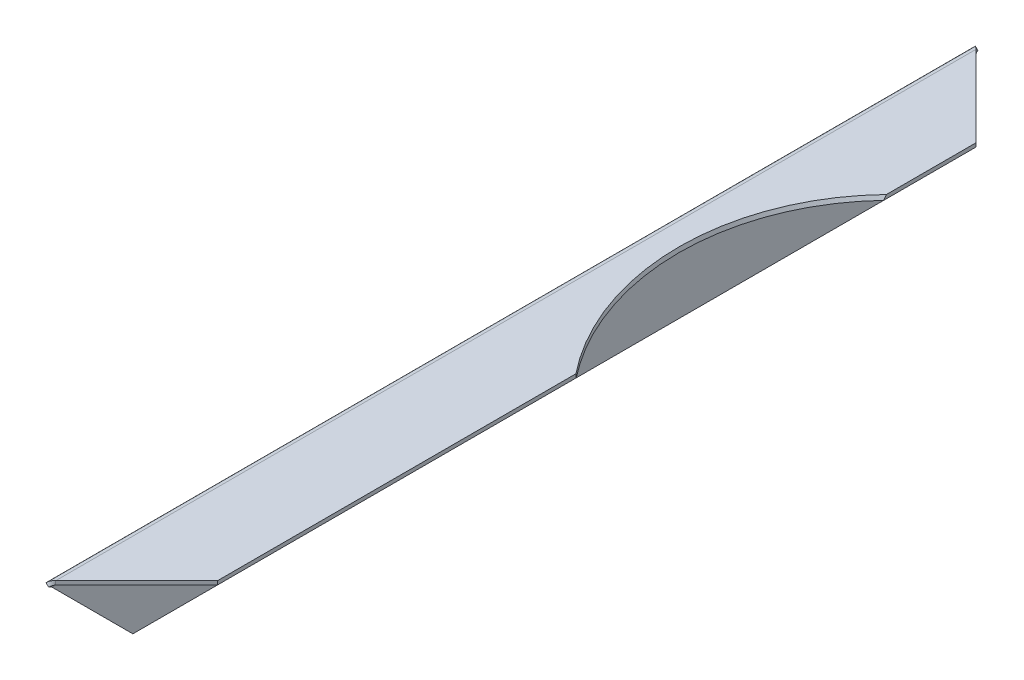
ISO-10303-21;
HEADER;
FILE_DESCRIPTION(('STEP AP214'),'2;1');
FILE_NAME('part.step','',(''),(''),'','','');
FILE_SCHEMA(('AUTOMOTIVE_DESIGN { 1 0 10303 214 1 1 1 1 }'));
ENDSEC;
DATA;
#1=APPLICATION_CONTEXT('core data for automotive mechanical design processes');
#2=APPLICATION_PROTOCOL_DEFINITION('international standard','automotive_design',2000,#1);
#3=PRODUCT_CONTEXT('',#1,'mechanical');
#4=PRODUCT('Part','Part','',(#3));
#5=PRODUCT_RELATED_PRODUCT_CATEGORY('part','',(#4));
#6=PRODUCT_DEFINITION_FORMATION('','',#4);
#7=PRODUCT_DEFINITION_CONTEXT('part definition',#1,'design');
#8=PRODUCT_DEFINITION('design','',#6,#7);
#9=PRODUCT_DEFINITION_SHAPE('','',#8);
#10=(LENGTH_UNIT() NAMED_UNIT(*) SI_UNIT(.MILLI.,.METRE.));
#11=(NAMED_UNIT(*) PLANE_ANGLE_UNIT() SI_UNIT($,.RADIAN.));
#12=(NAMED_UNIT(*) SI_UNIT($,.STERADIAN.) SOLID_ANGLE_UNIT());
#13=UNCERTAINTY_MEASURE_WITH_UNIT(LENGTH_MEASURE(1.E-05),#10,'distance_accuracy_value','');
#14=(GEOMETRIC_REPRESENTATION_CONTEXT(3) GLOBAL_UNCERTAINTY_ASSIGNED_CONTEXT((#13)) GLOBAL_UNIT_ASSIGNED_CONTEXT((#10,
#11,#12)) REPRESENTATION_CONTEXT('',''));
#15=CARTESIAN_POINT('',(0.,0.,0.));
#16=DIRECTION('',(0.,0.,1.));
#17=DIRECTION('',(1.,0.,0.));
#18=AXIS2_PLACEMENT_3D('',#15,#16,#17);
#19=CARTESIAN_POINT('',(-75.1616434307379,91.8897069999997,74.9733070000015));
#20=DIRECTION('',(-1.,0.,0.));
#21=DIRECTION('',(0.,0.,-1.));
#22=AXIS2_PLACEMENT_3D('',#19,#20,#21);
#23=PLANE('',#22);
#24=DIRECTION('',(0.,0.,1.));
#25=VECTOR('',#24,1.);
#26=CARTESIAN_POINT('',(-75.1616434307379,92.6263069999997,74.9733070000015));
#27=LINE('',#26,#25);
#28=CARTESIAN_POINT('',(-75.1616434307379,92.6263069999997,-74.9733070000015));
#29=VERTEX_POINT('',#28);
#30=CARTESIAN_POINT('',(-75.1616434307379,92.6263069999997,-57.2131080184539));
#31=VERTEX_POINT('',#30);
#32=EDGE_CURVE('E140',#29,#31,#27,.T.);
#33=ORIENTED_EDGE('',*,*,#32,.T.);
#34=CARTESIAN_POINT('',(-75.1616434307382,194.963224817041,-58.1000141663));
#35=DIRECTION('',(-1.,0.,0.));
#36=DIRECTION('',(0.,0.945156330465368,-0.326618295539672));
#37=AXIS2_PLACEMENT_3D('',#34,#35,#36);
#38=ELLIPSE('',#37,142.645185752417,44.45);
#39=CARTESIAN_POINT('',(-75.1616434307379,91.8897069999997,-56.6912719363768));
#40=VERTEX_POINT('',#39);
#41=EDGE_CURVE('E47',#31,#40,#38,.T.);
#42=ORIENTED_EDGE('',*,*,#41,.T.);
#43=DIRECTION('',(0.,0.,1.));
#44=VECTOR('',#43,1.);
#45=CARTESIAN_POINT('',(-75.1616434307379,91.8897069999997,74.9733070000015));
#46=LINE('',#45,#44);
#47=CARTESIAN_POINT('',(-75.1616434307379,91.8897069999997,-74.9733070000015));
#48=VERTEX_POINT('',#47);
#49=EDGE_CURVE('E372',#48,#40,#46,.T.);
#50=ORIENTED_EDGE('',*,*,#49,.F.);
#51=DIRECTION('',(0.,1.,0.));
#52=VECTOR('',#51,1.);
#53=CARTESIAN_POINT('',(-75.1616434307379,91.8897069999997,-74.9733070000015));
#54=LINE('',#53,#52);
#55=EDGE_CURVE('E143',#48,#29,#54,.T.);
#56=ORIENTED_EDGE('',*,*,#55,.T.);
#57=EDGE_LOOP('',(#33,#42,#50,#56));
#58=FACE_BOUND('',#57,.T.);
#59=ADVANCED_FACE('F32',(#58),#23,.F.);
#60=CARTESIAN_POINT('',(-92.6263069999994,0.18833643072165,0.));
#61=DIRECTION('',(-1.,0.,0.));
#62=DIRECTION('',(0.,0.,1.));
#63=AXIS2_PLACEMENT_3D('',#60,#61,#62);
#64=PLANE('',#63);
#65=DIRECTION('',(0.,-0.707106781186615,-0.70710678118648));
#66=VECTOR('',#65,1.);
#67=CARTESIAN_POINT('',(-92.6263070000001,92.0208934307375,91.8325569999984));
#68=LINE('',#67,#66);
#69=CARTESIAN_POINT('',(-92.6263070000001,91.1531069999997,90.9647705692607));
#70=VERTEX_POINT('',#69);
#71=CARTESIAN_POINT('',(-92.626307,75.1616434307375,74.9733070000015));
#72=VERTEX_POINT('',#71);
#73=EDGE_CURVE('E55',#70,#72,#68,.T.);
#74=ORIENTED_EDGE('',*,*,#73,.F.);
#75=DIRECTION('',(0.,0.,-1.));
#76=VECTOR('',#75,1.);
#77=CARTESIAN_POINT('',(-92.6263070000001,91.1531069999997,0.));
#78=LINE('',#77,#76);
#79=CARTESIAN_POINT('',(-92.626307,91.1531069999997,-90.9647705692606));
#80=VERTEX_POINT('',#79);
#81=EDGE_CURVE('E239',#70,#80,#78,.T.);
#82=ORIENTED_EDGE('',*,*,#81,.T.);
#83=DIRECTION('',(0.,0.707106781186615,-0.70710678118648));
#84=VECTOR('',#83,1.);
#85=CARTESIAN_POINT('',(-92.6263070000001,92.0208934307375,-91.8325569999983));
#86=LINE('',#85,#84);
#87=CARTESIAN_POINT('',(-92.626307,75.1616434307375,-74.9733070000015));
#88=VERTEX_POINT('',#87);
#89=EDGE_CURVE('E211',#88,#80,#86,.T.);
#90=ORIENTED_EDGE('',*,*,#89,.F.);
#91=DIRECTION('',(0.,0.,-1.));
#92=VECTOR('',#91,1.);
#93=CARTESIAN_POINT('',(-92.626307,75.1616434307375,74.9733070000015));
#94=LINE('',#93,#92);
#95=EDGE_CURVE('E209',#72,#88,#94,.T.);
#96=ORIENTED_EDGE('',*,*,#95,.F.);
#97=EDGE_LOOP('',(#74,#82,#90,#96));
#98=FACE_BOUND('',#97,.T.);
#99=ADVANCED_FACE('F270',(#98),#64,.T.);
#100=CARTESIAN_POINT('',(-91.8897070000001,92.0208934307375,91.8325569999984));
#101=DIRECTION('',(0.,0.70710678118648,-0.707106781186615));
#102=DIRECTION('',(0.,0.707106781186615,0.70710678118648));
#103=AXIS2_PLACEMENT_3D('',#100,#101,#102);
#104=PLANE('',#103);
#105=CARTESIAN_POINT('',(-92.626307,91.1531069999996,90.9647705692607));
#106=CARTESIAN_POINT('',(-91.889707,91.1531069999997,90.9647705692607));
#107=B_SPLINE_CURVE_WITH_KNOTS('',1,(#105,#106),.UNSPECIFIED.,.F.,.F.,(2,2),(0.,1.),.UNSPECIFIED.);
#108=CARTESIAN_POINT('',(-91.8897070000001,91.1531069999997,90.9647705692607));
#109=VERTEX_POINT('',#108);
#110=EDGE_CURVE('E41',#70,#109,#107,.T.);
#111=ORIENTED_EDGE('',*,*,#110,.F.);
#112=ORIENTED_EDGE('',*,*,#73,.T.);
#113=DIRECTION('',(-1.,0.,0.));
#114=VECTOR('',#113,1.);
#115=CARTESIAN_POINT('',(-91.889707,75.1616434307375,74.9733070000015));
#116=LINE('',#115,#114);
#117=CARTESIAN_POINT('',(-91.889707,75.1616434307375,74.9733070000015));
#118=VERTEX_POINT('',#117);
#119=EDGE_CURVE('E215',#118,#72,#116,.T.);
#120=ORIENTED_EDGE('',*,*,#119,.F.);
#121=DIRECTION('',(0.,-0.707106781186615,-0.70710678118648));
#122=VECTOR('',#121,1.);
#123=CARTESIAN_POINT('',(-91.8897070000001,92.0208934307375,91.8325569999984));
#124=LINE('',#123,#122);
#125=EDGE_CURVE('E208',#109,#118,#124,.T.);
#126=ORIENTED_EDGE('',*,*,#125,.F.);
#127=EDGE_LOOP('',(#111,#112,#120,#126));
#128=FACE_BOUND('',#127,.T.);
#129=ADVANCED_FACE('F34',(#128),#104,.F.);
#130=CARTESIAN_POINT('',(-91.889707,75.1616434307375,74.9733070000015));
#131=DIRECTION('',(0.,1.,0.));
#132=DIRECTION('',(0.,0.,1.));
#133=AXIS2_PLACEMENT_3D('',#130,#131,#132);
#134=PLANE('',#133);
#135=ORIENTED_EDGE('',*,*,#95,.T.);
#136=DIRECTION('',(-1.,0.,0.));
#137=VECTOR('',#136,1.);
#138=CARTESIAN_POINT('',(-91.8897069999999,75.1616434307375,-74.9733070000015));
#139=LINE('',#138,#137);
#140=CARTESIAN_POINT('',(-91.8897069999999,75.1616434307375,-74.9733070000015));
#141=VERTEX_POINT('',#140);
#142=EDGE_CURVE('E212',#141,#88,#139,.T.);
#143=ORIENTED_EDGE('',*,*,#142,.F.);
#144=DIRECTION('',(0.,0.,-1.));
#145=VECTOR('',#144,1.);
#146=CARTESIAN_POINT('',(-91.889707,75.1616434307375,74.9733070000015));
#147=LINE('',#146,#145);
#148=EDGE_CURVE('E205',#118,#141,#147,.T.);
#149=ORIENTED_EDGE('',*,*,#148,.F.);
#150=ORIENTED_EDGE('',*,*,#119,.T.);
#151=EDGE_LOOP('',(#135,#143,#149,#150));
#152=FACE_BOUND('',#151,.T.);
#153=ADVANCED_FACE('F187',(#152),#134,.F.);
#154=CARTESIAN_POINT('',(-91.8897070000001,92.0208934307376,-91.8325569999983));
#155=DIRECTION('',(0.,0.70710678118648,0.707106781186615));
#156=DIRECTION('',(0.,-0.707106781186615,0.70710678118648));
#157=AXIS2_PLACEMENT_3D('',#154,#155,#156);
#158=PLANE('',#157);
#159=CARTESIAN_POINT('',(-91.889707,91.1531069999997,-90.9647705692606));
#160=CARTESIAN_POINT('',(-92.626307,91.1531069999996,-90.9647705692606));
#161=B_SPLINE_CURVE_WITH_KNOTS('',1,(#159,#160),.UNSPECIFIED.,.F.,.F.,(2,2),(0.,1.),.UNSPECIFIED.);
#162=CARTESIAN_POINT('',(-91.889707,91.1531069999997,-90.9647705692606));
#163=VERTEX_POINT('',#162);
#164=EDGE_CURVE('E225',#163,#80,#161,.T.);
#165=ORIENTED_EDGE('',*,*,#164,.F.);
#166=DIRECTION('',(0.,0.707106781186615,-0.70710678118648));
#167=VECTOR('',#166,1.);
#168=CARTESIAN_POINT('',(-91.8897070000001,92.0208934307376,-91.8325569999983));
#169=LINE('',#168,#167);
#170=EDGE_CURVE('E207',#141,#163,#169,.T.);
#171=ORIENTED_EDGE('',*,*,#170,.F.);
#172=ORIENTED_EDGE('',*,*,#142,.T.);
#173=ORIENTED_EDGE('',*,*,#89,.T.);
#174=EDGE_LOOP('',(#165,#171,#172,#173));
#175=FACE_BOUND('',#174,.T.);
#176=ADVANCED_FACE('F261',(#175),#158,.F.);
#177=CARTESIAN_POINT('',(-91.8897069999994,0.18833643072165,0.));
#178=DIRECTION('',(-1.,0.,0.));
#179=DIRECTION('',(0.,0.,1.));
#180=AXIS2_PLACEMENT_3D('',#177,#178,#179);
#181=PLANE('',#180);
#182=DIRECTION('',(0.,0.,-1.));
#183=VECTOR('',#182,1.);
#184=CARTESIAN_POINT('',(-91.8897070000001,91.1531069999997,0.));
#185=LINE('',#184,#183);
#186=EDGE_CURVE('E218',#109,#163,#185,.T.);
#187=ORIENTED_EDGE('',*,*,#186,.F.);
#188=ORIENTED_EDGE('',*,*,#125,.T.);
#189=ORIENTED_EDGE('',*,*,#148,.T.);
#190=ORIENTED_EDGE('',*,*,#170,.T.);
#191=EDGE_LOOP('',(#187,#188,#189,#190));
#192=FACE_BOUND('',#191,.T.);
#193=ADVANCED_FACE('F269',(#192),#181,.F.);
#194=CARTESIAN_POINT('',(-75.1616434307379,91.8897069999997,4.07489752633966));
#195=VERTEX_POINT('',#194);
#196=CARTESIAN_POINT('',(-75.1616434307379,91.8897069999997,74.9733070000015));
#197=VERTEX_POINT('',#196);
#198=EDGE_CURVE('E133',#195,#197,#46,.T.);
#199=ORIENTED_EDGE('',*,*,#198,.F.);
#200=CARTESIAN_POINT('',(-75.1616434307379,92.6263069999997,4.14234221408703));
#201=VERTEX_POINT('',#200);
#202=EDGE_CURVE('E121',#195,#201,#38,.T.);
#203=ORIENTED_EDGE('',*,*,#202,.T.);
#204=CARTESIAN_POINT('',(-75.1616434307379,92.6263069999997,74.9733070000015));
#205=VERTEX_POINT('',#204);
#206=EDGE_CURVE('E131',#201,#205,#27,.T.);
#207=ORIENTED_EDGE('',*,*,#206,.T.);
#208=DIRECTION('',(0.,1.,0.));
#209=VECTOR('',#208,1.);
#210=CARTESIAN_POINT('',(-75.1616434307379,91.8897069999997,74.9733070000015));
#211=LINE('',#210,#209);
#212=EDGE_CURVE('E249',#197,#205,#211,.T.);
#213=ORIENTED_EDGE('',*,*,#212,.F.);
#214=EDGE_LOOP('',(#199,#203,#207,#213));
#215=FACE_BOUND('',#214,.T.);
#216=ADVANCED_FACE('F129',(#215),#23,.F.);
#217=CARTESIAN_POINT('',(-183.853450430754,91.8897069999994,0.));
#218=DIRECTION('',(0.,1.,0.));
#219=DIRECTION('',(0.,0.,1.));
#220=AXIS2_PLACEMENT_3D('',#217,#218,#219);
#221=PLANE('',#220);
#222=ORIENTED_EDGE('',*,*,#49,.T.);
#223=CARTESIAN_POINT('',(-39.3982424592793,91.8897069999998,-22.4808307365029));
#224=DIRECTION('',(0.,1.,0.));
#225=DIRECTION('',(-0.708533935724144,0.,-0.705676740389858));
#226=AXIS2_PLACEMENT_3D('',#223,#224,#225);
#227=ELLIPSE('',#226,49.4935758743306,44.45);
#228=EDGE_CURVE('E350',#40,#195,#227,.T.);
#229=ORIENTED_EDGE('',*,*,#228,.T.);
#230=ORIENTED_EDGE('',*,*,#198,.T.);
#231=DIRECTION('',(-0.707106781186614,0.,0.707106781186481));
#232=VECTOR('',#231,1.);
#233=CARTESIAN_POINT('',(-92.0208934307379,91.8897069999997,91.8325569999984));
#234=LINE('',#233,#232);
#235=CARTESIAN_POINT('',(-91.153107,91.8897069999997,90.9647705692607));
#236=VERTEX_POINT('',#235);
#237=EDGE_CURVE('E368',#197,#236,#234,.T.);
#238=ORIENTED_EDGE('',*,*,#237,.T.);
#239=DIRECTION('',(0.,0.,-1.));
#240=VECTOR('',#239,1.);
#241=CARTESIAN_POINT('',(-91.153107,91.8897069999997,0.));
#242=LINE('',#241,#240);
#243=CARTESIAN_POINT('',(-91.153107,91.8897069999997,-90.9647705692606));
#244=VERTEX_POINT('',#243);
#245=EDGE_CURVE('E165',#236,#244,#242,.T.);
#246=ORIENTED_EDGE('',*,*,#245,.T.);
#247=DIRECTION('',(0.707106781186614,0.,0.707106781186481));
#248=VECTOR('',#247,1.);
#249=CARTESIAN_POINT('',(-92.0208934307379,91.8897069999997,-91.8325569999983));
#250=LINE('',#249,#248);
#251=EDGE_CURVE('E365',#244,#48,#250,.T.);
#252=ORIENTED_EDGE('',*,*,#251,.T.);
#253=EDGE_LOOP('',(#222,#229,#230,#238,#246,#252));
#254=FACE_BOUND('',#253,.T.);
#255=ADVANCED_FACE('F177',(#254),#221,.F.);
#256=CARTESIAN_POINT('',(-92.0208934307379,91.8897069999997,-91.8325569999983));
#257=DIRECTION('',(-0.707106781186481,0.,0.707106781186614));
#258=DIRECTION('',(-0.707106781186614,0.,-0.707106781186481));
#259=AXIS2_PLACEMENT_3D('',#256,#257,#258);
#260=PLANE('',#259);
#261=ORIENTED_EDGE('',*,*,#251,.F.);
#262=CARTESIAN_POINT('',(-91.153107,92.6263069999997,-90.9647705692606));
#263=CARTESIAN_POINT('',(-91.153107,91.8897069999997,-90.9647705692606));
#264=B_SPLINE_CURVE_WITH_KNOTS('',1,(#262,#263),.UNSPECIFIED.,.F.,.F.,(2,2),(0.,1.),.UNSPECIFIED.);
#265=CARTESIAN_POINT('',(-91.153107,92.6263069999997,-90.9647705692606));
#266=VERTEX_POINT('',#265);
#267=EDGE_CURVE('E154',#244,#266,#264,.F.);
#268=ORIENTED_EDGE('',*,*,#267,.T.);
#269=DIRECTION('',(0.707106781186614,0.,0.707106781186481));
#270=VECTOR('',#269,1.);
#271=CARTESIAN_POINT('',(-92.0208934307379,92.6263069999997,-91.8325569999983));
#272=LINE('',#271,#270);
#273=EDGE_CURVE('E152',#266,#29,#272,.T.);
#274=ORIENTED_EDGE('',*,*,#273,.T.);
#275=ORIENTED_EDGE('',*,*,#55,.F.);
#276=EDGE_LOOP('',(#261,#268,#274,#275));
#277=FACE_BOUND('',#276,.T.);
#278=ADVANCED_FACE('F167',(#277),#260,.F.);
#279=CARTESIAN_POINT('',(-183.853450430754,92.6263069999994,0.));
#280=DIRECTION('',(0.,1.,0.));
#281=DIRECTION('',(0.,0.,1.));
#282=AXIS2_PLACEMENT_3D('',#279,#280,#281);
#283=PLANE('',#282);
#284=CARTESIAN_POINT('',(-39.6538204361786,92.6263069999999,-22.7353780835816));
#285=DIRECTION('',(0.,1.,0.));
#286=DIRECTION('',(-0.708533935724144,0.,-0.705676740389858));
#287=AXIS2_PLACEMENT_3D('',#284,#285,#286);
#288=ELLIPSE('',#287,49.4935758743306,44.45);
#289=EDGE_CURVE('E11',#31,#201,#288,.T.);
#290=ORIENTED_EDGE('',*,*,#289,.F.);
#291=ORIENTED_EDGE('',*,*,#32,.F.);
#292=ORIENTED_EDGE('',*,*,#273,.F.);
#293=DIRECTION('',(0.,0.,-1.));
#294=VECTOR('',#293,1.);
#295=CARTESIAN_POINT('',(-91.153107,92.6263069999997,0.));
#296=LINE('',#295,#294);
#297=CARTESIAN_POINT('',(-91.153107,92.6263069999997,90.9647705692607));
#298=VERTEX_POINT('',#297);
#299=EDGE_CURVE('E141',#298,#266,#296,.T.);
#300=ORIENTED_EDGE('',*,*,#299,.F.);
#301=DIRECTION('',(-0.707106781186614,0.,0.707106781186481));
#302=VECTOR('',#301,1.);
#303=CARTESIAN_POINT('',(-92.0208934307379,92.6263069999997,91.8325569999984));
#304=LINE('',#303,#302);
#305=EDGE_CURVE('E139',#205,#298,#304,.T.);
#306=ORIENTED_EDGE('',*,*,#305,.F.);
#307=ORIENTED_EDGE('',*,*,#206,.F.);
#308=EDGE_LOOP('',(#290,#291,#292,#300,#306,#307));
#309=FACE_BOUND('',#308,.T.);
#310=ADVANCED_FACE('F136',(#309),#283,.T.);
#311=CARTESIAN_POINT('',(-92.0208934307379,91.8897069999997,91.8325569999984));
#312=DIRECTION('',(-0.707106781186481,0.,-0.707106781186614));
#313=DIRECTION('',(0.707106781186614,0.,-0.707106781186481));
#314=AXIS2_PLACEMENT_3D('',#311,#312,#313);
#315=PLANE('',#314);
#316=ORIENTED_EDGE('',*,*,#305,.T.);
#317=CARTESIAN_POINT('',(-91.153107,91.8897069999997,90.9647705692607));
#318=CARTESIAN_POINT('',(-91.153107,92.6263069999997,90.9647705692607));
#319=B_SPLINE_CURVE_WITH_KNOTS('',1,(#317,#318),.UNSPECIFIED.,.F.,.F.,(2,2),(0.,1.),.UNSPECIFIED.);
#320=EDGE_CURVE('E202',#298,#236,#319,.F.);
#321=ORIENTED_EDGE('',*,*,#320,.T.);
#322=ORIENTED_EDGE('',*,*,#237,.F.);
#323=ORIENTED_EDGE('',*,*,#212,.T.);
#324=EDGE_LOOP('',(#316,#321,#322,#323));
#325=FACE_BOUND('',#324,.T.);
#326=ADVANCED_FACE('F181',(#325),#315,.F.);
#327=CARTESIAN_POINT('',(-92.1948167100441,92.1948167100437,91.8325569999984));
#328=CARTESIAN_POINT('',(-92.3311919267768,92.0584414933109,91.6879092391921));
#329=CARTESIAN_POINT('',(-92.4403691073235,91.895038481882,91.5432948564191));
#330=CARTESIAN_POINT('',(-92.5879635472678,91.5387139832377,91.2540327128399));
#331=CARTESIAN_POINT('',(-92.626307,91.3459706810746,91.1094183300669));
#332=CARTESIAN_POINT('',(-92.626307,91.1531069999996,90.9647705692607));
#333=CARTESIAN_POINT('',(-91.6739618550221,91.6739618550217,91.8325569999984));
#334=CARTESIAN_POINT('',(-91.7421453784557,91.6057783315881,91.6879179046431));
#335=CARTESIAN_POINT('',(-91.7967380536618,91.5240727409409,91.5432948564191));
#336=CARTESIAN_POINT('',(-91.8705352736339,91.3459104916187,91.2540327128399));
#337=CARTESIAN_POINT('',(-91.889707,91.2495330635698,91.109409664616));
#338=CARTESIAN_POINT('',(-91.889707,91.1531069999997,90.9647705692607));
#339=B_SPLINE_SURFACE_WITH_KNOTS('',1,3,((#327,#328,#329,#330,#331,#332),(#333,#334,#335,#336,
#337,#338)),.UNSPECIFIED.,.F.,.F.,.F.,(2,2),(4,2,4),(0.,1.),(0.,0.5,1.),.UNSPECIFIED.);
#340=CARTESIAN_POINT('',(-92.1948167100441,92.1948167100437,91.8325569999983));
#341=CARTESIAN_POINT('',(-91.6739618550221,91.6739618550217,91.8325569999983));
#342=B_SPLINE_CURVE_WITH_KNOTS('',1,(#340,#341),.UNSPECIFIED.,.F.,.F.,(2,2),(0.,1.),.UNSPECIFIED.);
#343=CARTESIAN_POINT('',(-92.1948169457465,92.1948164743412,91.8325567499982));
#344=VERTEX_POINT('',#343);
#345=CARTESIAN_POINT('',(-91.6739618550221,91.6739618550217,91.8325569999984));
#346=VERTEX_POINT('',#345);
#347=EDGE_CURVE('E145',#344,#346,#342,.T.);
#348=CARTESIAN_POINT('',(-92.1948167100441,92.1948167100437,91.8325569999984));
#349=CARTESIAN_POINT('',(-92.3311919267768,92.0584414933109,91.6879092391921));
#350=CARTESIAN_POINT('',(-92.4403691073235,91.895038481882,91.5432948564191));
#351=CARTESIAN_POINT('',(-92.5879635472678,91.5387139832377,91.2540327128399));
#352=CARTESIAN_POINT('',(-92.626307,91.3459706810746,91.1094183300669));
#353=CARTESIAN_POINT('',(-92.626307,91.1531069999996,90.9647705692607));
#354=B_SPLINE_CURVE_WITH_KNOTS('',3,(#348,#349,#350,#351,#352,#353),.UNSPECIFIED.,.F.,.F.,(4,2,
4),(0.,0.5,1.),.UNSPECIFIED.);
#355=EDGE_CURVE('E303',#344,#70,#354,.T.);
#356=CARTESIAN_POINT('',(-91.889707,91.1531069999997,90.9647705692607));
#357=CARTESIAN_POINT('',(-91.889707,91.2495330635698,91.109409664616));
#358=CARTESIAN_POINT('',(-91.8705352736339,91.3459104916187,91.2540327128399));
#359=CARTESIAN_POINT('',(-91.7967380536618,91.5240727409409,91.5432948564191));
#360=CARTESIAN_POINT('',(-91.7421453784557,91.6057783315881,91.6879179046431));
#361=CARTESIAN_POINT('',(-91.6739618550221,91.6739618550217,91.8325569999984));
#362=B_SPLINE_CURVE_WITH_KNOTS('',3,(#356,#357,#358,#359,#360,#361),.UNSPECIFIED.,.F.,.F.,(4,2,
4),(0.,0.5,1.),.UNSPECIFIED.);
#363=EDGE_CURVE('E299',#346,#109,#362,.F.);
#364=ORIENTED_EDGE('',*,*,#347,.F.);
#365=ORIENTED_EDGE('',*,*,#355,.T.);
#366=ORIENTED_EDGE('',*,*,#110,.T.);
#367=ORIENTED_EDGE('',*,*,#363,.F.);
#368=EDGE_LOOP('',(#364,#365,#366,#367));
#369=FACE_BOUND('',#368,.T.);
#370=ADVANCED_FACE('F185',(#369),#339,.F.);
#371=CARTESIAN_POINT('',(-92.626307,91.1531069999996,-90.9647705692606));
#372=CARTESIAN_POINT('',(-92.626307,91.3459706810746,-91.1094183300668));
#373=CARTESIAN_POINT('',(-92.5879635472678,91.5387139832378,-91.2540327128399));
#374=CARTESIAN_POINT('',(-92.4403691073235,91.8950384818821,-91.5432948564191));
#375=CARTESIAN_POINT('',(-92.3311919267768,92.058441493311,-91.6879092391921));
#376=CARTESIAN_POINT('',(-92.1948167100441,92.1948167100437,-91.8325569999983));
#377=CARTESIAN_POINT('',(-91.889707,91.1531069999997,-90.9647705692606));
#378=CARTESIAN_POINT('',(-91.889707,91.2495330635699,-91.109409664616));
#379=CARTESIAN_POINT('',(-91.8705352736339,91.3459104916187,-91.2540327128399));
#380=CARTESIAN_POINT('',(-91.7967380536618,91.5240727409409,-91.5432948564191));
#381=CARTESIAN_POINT('',(-91.7421453784557,91.605778331588,-91.687917904643));
#382=CARTESIAN_POINT('',(-91.673961855022,91.6739618550217,-91.8325569999983));
#383=B_SPLINE_SURFACE_WITH_KNOTS('',1,3,((#371,#372,#373,#374,#375,#376),(#377,#378,#379,#380,
#381,#382)),.UNSPECIFIED.,.F.,.F.,.F.,(2,2),(4,2,4),(0.,1.),(0.,0.5,1.),.UNSPECIFIED.);
#384=CARTESIAN_POINT('',(-92.626307,91.1531069999996,-90.9647705692606));
#385=CARTESIAN_POINT('',(-92.626307,91.3459706810746,-91.1094183300668));
#386=CARTESIAN_POINT('',(-92.5879635472678,91.5387139832378,-91.2540327128399));
#387=CARTESIAN_POINT('',(-92.4403691073235,91.8950384818821,-91.5432948564191));
#388=CARTESIAN_POINT('',(-92.3311919267768,92.058441493311,-91.6879092391921));
#389=CARTESIAN_POINT('',(-92.1948167100441,92.1948167100437,-91.8325569999983));
#390=B_SPLINE_CURVE_WITH_KNOTS('',3,(#384,#385,#386,#387,#388,#389),.UNSPECIFIED.,.F.,.F.,(4,2,
4),(0.,0.5,1.),.UNSPECIFIED.);
#391=CARTESIAN_POINT('',(-92.1948169457464,92.1948164743413,-91.8325567499982));
#392=VERTEX_POINT('',#391);
#393=EDGE_CURVE('E395',#80,#392,#390,.T.);
#394=CARTESIAN_POINT('',(-92.1948167100441,92.1948167100437,-91.8325569999983));
#395=CARTESIAN_POINT('',(-91.673961855022,91.6739618550217,-91.8325569999983));
#396=B_SPLINE_CURVE_WITH_KNOTS('',1,(#394,#395),.UNSPECIFIED.,.F.,.F.,(2,2),(0.,1.),.UNSPECIFIED.);
#397=CARTESIAN_POINT('',(-91.673961855022,91.6739618550217,-91.8325569999983));
#398=VERTEX_POINT('',#397);
#399=EDGE_CURVE('E400',#392,#398,#396,.T.);
#400=CARTESIAN_POINT('',(-91.673961855022,91.6739618550217,-91.8325569999983));
#401=CARTESIAN_POINT('',(-91.7421453784557,91.605778331588,-91.687917904643));
#402=CARTESIAN_POINT('',(-91.7967380536618,91.5240727409409,-91.5432948564191));
#403=CARTESIAN_POINT('',(-91.8705352736339,91.3459104916187,-91.2540327128399));
#404=CARTESIAN_POINT('',(-91.889707,91.2495330635699,-91.109409664616));
#405=CARTESIAN_POINT('',(-91.889707,91.1531069999997,-90.9647705692606));
#406=B_SPLINE_CURVE_WITH_KNOTS('',3,(#400,#401,#402,#403,#404,#405),.UNSPECIFIED.,.F.,.F.,(4,2,
4),(0.,0.5,1.),.UNSPECIFIED.);
#407=EDGE_CURVE('E312',#163,#398,#406,.F.);
#408=ORIENTED_EDGE('',*,*,#164,.T.);
#409=ORIENTED_EDGE('',*,*,#393,.T.);
#410=ORIENTED_EDGE('',*,*,#399,.T.);
#411=ORIENTED_EDGE('',*,*,#407,.F.);
#412=EDGE_LOOP('',(#408,#409,#410,#411));
#413=FACE_BOUND('',#412,.T.);
#414=ADVANCED_FACE('F419',(#413),#383,.F.);
#415=CARTESIAN_POINT('',(-92.1948167100441,92.1948167100437,-91.8325569999983));
#416=CARTESIAN_POINT('',(-92.0584414933113,92.3311919267765,-91.6879092391921));
#417=CARTESIAN_POINT('',(-91.8950384818824,92.4403691073232,-91.5432948564191));
#418=CARTESIAN_POINT('',(-91.5387139832381,92.5879635472675,-91.2540327128399));
#419=CARTESIAN_POINT('',(-91.345970681075,92.6263069999997,-91.1094183300668));
#420=CARTESIAN_POINT('',(-91.153107,92.6263069999997,-90.9647705692606));
#421=CARTESIAN_POINT('',(-91.673961855022,91.6739618550217,-91.8325569999983));
#422=CARTESIAN_POINT('',(-91.6057783315884,91.7421453784553,-91.687917904643));
#423=CARTESIAN_POINT('',(-91.5240727409412,91.7967380536614,-91.5432948564191));
#424=CARTESIAN_POINT('',(-91.3459104916191,91.8705352736336,-91.2540327128399));
#425=CARTESIAN_POINT('',(-91.2495330635702,91.8897069999997,-91.1094096646159));
#426=CARTESIAN_POINT('',(-91.153107,91.8897069999997,-90.9647705692606));
#427=B_SPLINE_SURFACE_WITH_KNOTS('',1,3,((#415,#416,#417,#418,#419,#420),(#421,#422,#423,#424,
#425,#426)),.UNSPECIFIED.,.F.,.F.,.F.,(2,2),(4,2,4),(0.,1.),(0.,0.5,1.),.UNSPECIFIED.);
#428=CARTESIAN_POINT('',(-92.1948167100441,92.1948167100437,-91.8325569999983));
#429=CARTESIAN_POINT('',(-92.0584414933113,92.3311919267765,-91.6879092391921));
#430=CARTESIAN_POINT('',(-91.8950384818824,92.4403691073232,-91.5432948564191));
#431=CARTESIAN_POINT('',(-91.5387139832381,92.5879635472675,-91.2540327128399));
#432=CARTESIAN_POINT('',(-91.345970681075,92.6263069999997,-91.1094183300668));
#433=CARTESIAN_POINT('',(-91.153107,92.6263069999997,-90.9647705692606));
#434=B_SPLINE_CURVE_WITH_KNOTS('',3,(#428,#429,#430,#431,#432,#433),.UNSPECIFIED.,.F.,.F.,(4,2,
4),(0.,0.5,1.),.UNSPECIFIED.);
#435=EDGE_CURVE('E383',#392,#266,#434,.T.);
#436=CARTESIAN_POINT('',(-91.153107,91.8897069999997,-90.9647705692606));
#437=CARTESIAN_POINT('',(-91.2495330635702,91.8897069999997,-91.1094096646159));
#438=CARTESIAN_POINT('',(-91.3459104916191,91.8705352736336,-91.2540327128399));
#439=CARTESIAN_POINT('',(-91.5240727409412,91.7967380536614,-91.5432948564191));
#440=CARTESIAN_POINT('',(-91.6057783315884,91.7421453784553,-91.687917904643));
#441=CARTESIAN_POINT('',(-91.673961855022,91.6739618550217,-91.8325569999983));
#442=B_SPLINE_CURVE_WITH_KNOTS('',3,(#436,#437,#438,#439,#440,#441),.UNSPECIFIED.,.F.,.F.,(4,2,
4),(0.,0.5,1.),.UNSPECIFIED.);
#443=EDGE_CURVE('E358',#398,#244,#442,.F.);
#444=ORIENTED_EDGE('',*,*,#399,.F.);
#445=ORIENTED_EDGE('',*,*,#435,.T.);
#446=ORIENTED_EDGE('',*,*,#267,.F.);
#447=ORIENTED_EDGE('',*,*,#443,.F.);
#448=EDGE_LOOP('',(#444,#445,#446,#447));
#449=FACE_BOUND('',#448,.T.);
#450=ADVANCED_FACE('F335',(#449),#427,.F.);
#451=CARTESIAN_POINT('',(-91.153107,92.6263069999997,90.9647705692607));
#452=CARTESIAN_POINT('',(-91.345970681075,92.6263069999997,91.1094183300669));
#453=CARTESIAN_POINT('',(-91.5387139832381,92.5879635472674,91.2540327128399));
#454=CARTESIAN_POINT('',(-91.8950384818825,92.4403691073231,91.5432948564191));
#455=CARTESIAN_POINT('',(-92.0584414933113,92.3311919267764,91.6879092391921));
#456=CARTESIAN_POINT('',(-92.1948167100441,92.1948167100437,91.8325569999983));
#457=CARTESIAN_POINT('',(-91.153107,91.8897069999997,90.9647705692607));
#458=CARTESIAN_POINT('',(-91.2495330635703,91.8897069999997,91.109409664616));
#459=CARTESIAN_POINT('',(-91.3459104916191,91.8705352736335,91.2540327128399));
#460=CARTESIAN_POINT('',(-91.5240727409413,91.7967380536614,91.5432948564191));
#461=CARTESIAN_POINT('',(-91.6057783315885,91.7421453784553,91.6879179046431));
#462=CARTESIAN_POINT('',(-91.6739618550221,91.6739618550217,91.8325569999983));
#463=B_SPLINE_SURFACE_WITH_KNOTS('',1,3,((#451,#452,#453,#454,#455,#456),(#457,#458,#459,#460,
#461,#462)),.UNSPECIFIED.,.F.,.F.,.F.,(2,2),(4,2,4),(0.,1.),(0.,0.5,1.),.UNSPECIFIED.);
#464=CARTESIAN_POINT('',(-91.153107,92.6263069999997,90.9647705692607));
#465=CARTESIAN_POINT('',(-91.345970681075,92.6263069999997,91.1094183300669));
#466=CARTESIAN_POINT('',(-91.5387139832381,92.5879635472674,91.2540327128399));
#467=CARTESIAN_POINT('',(-91.8950384818825,92.4403691073231,91.5432948564191));
#468=CARTESIAN_POINT('',(-92.0584414933113,92.3311919267764,91.6879092391921));
#469=CARTESIAN_POINT('',(-92.1948167100441,92.1948167100437,91.8325569999983));
#470=B_SPLINE_CURVE_WITH_KNOTS('',3,(#464,#465,#466,#467,#468,#469),.UNSPECIFIED.,.F.,.F.,(4,2,
4),(0.,0.5,1.),.UNSPECIFIED.);
#471=EDGE_CURVE('E313',#298,#344,#470,.T.);
#472=CARTESIAN_POINT('',(-91.6739618550221,91.6739618550217,91.8325569999983));
#473=CARTESIAN_POINT('',(-91.6057783315885,91.7421453784553,91.6879179046431));
#474=CARTESIAN_POINT('',(-91.5240727409413,91.7967380536614,91.5432948564191));
#475=CARTESIAN_POINT('',(-91.3459104916191,91.8705352736335,91.2540327128399));
#476=CARTESIAN_POINT('',(-91.2495330635703,91.8897069999997,91.109409664616));
#477=CARTESIAN_POINT('',(-91.153107,91.8897069999997,90.9647705692607));
#478=B_SPLINE_CURVE_WITH_KNOTS('',3,(#472,#473,#474,#475,#476,#477),.UNSPECIFIED.,.F.,.F.,(4,2,
4),(0.,0.5,1.),.UNSPECIFIED.);
#479=EDGE_CURVE('E310',#236,#346,#478,.F.);
#480=ORIENTED_EDGE('',*,*,#471,.T.);
#481=ORIENTED_EDGE('',*,*,#347,.T.);
#482=ORIENTED_EDGE('',*,*,#479,.F.);
#483=ORIENTED_EDGE('',*,*,#320,.F.);
#484=EDGE_LOOP('',(#480,#481,#482,#483));
#485=FACE_BOUND('',#484,.T.);
#486=ADVANCED_FACE('F334',(#485),#463,.F.);
#487=CARTESIAN_POINT('',(-91.153107,91.1531069999996,183.674791121017));
#488=DIRECTION('',(0.,0.,-1.));
#489=DIRECTION('',(1.,0.,0.));
#490=AXIS2_PLACEMENT_3D('',#487,#488,#489);
#491=CYLINDRICAL_SURFACE('',#490,0.7366);
#492=ORIENTED_EDGE('',*,*,#245,.F.);
#493=ORIENTED_EDGE('',*,*,#479,.T.);
#494=ORIENTED_EDGE('',*,*,#363,.T.);
#495=ORIENTED_EDGE('',*,*,#186,.T.);
#496=ORIENTED_EDGE('',*,*,#407,.T.);
#497=ORIENTED_EDGE('',*,*,#443,.T.);
#498=EDGE_LOOP('',(#492,#493,#494,#495,#496,#497));
#499=FACE_BOUND('',#498,.T.);
#500=ADVANCED_FACE('F308',(#499),#491,.F.);
#501=CARTESIAN_POINT('',(-91.153107,91.1531069999996,183.674791121017));
#502=DIRECTION('',(0.,0.,-1.));
#503=DIRECTION('',(1.,0.,0.));
#504=AXIS2_PLACEMENT_3D('',#501,#502,#503);
#505=CYLINDRICAL_SURFACE('',#504,1.4732);
#506=ORIENTED_EDGE('',*,*,#299,.T.);
#507=ORIENTED_EDGE('',*,*,#435,.F.);
#508=ORIENTED_EDGE('',*,*,#393,.F.);
#509=ORIENTED_EDGE('',*,*,#81,.F.);
#510=ORIENTED_EDGE('',*,*,#355,.F.);
#511=ORIENTED_EDGE('',*,*,#471,.F.);
#512=EDGE_LOOP('',(#506,#507,#508,#509,#510,#511));
#513=FACE_BOUND('',#512,.T.);
#514=ADVANCED_FACE('F333',(#513),#505,.T.);
#515=CARTESIAN_POINT('',(-27.1336498113814,56.5419863002622,-10.2656956164999));
#516=DIRECTION('',(-0.311612339144416,0.898096353208812,-0.310355748208371));
#517=DIRECTION('',(-0.944747526340175,-0.32779888876279,0.));
#518=AXIS2_PLACEMENT_3D('',#515,#516,#517);
#519=CYLINDRICAL_SURFACE('',#518,44.45);
#520=ORIENTED_EDGE('',*,*,#41,.F.);
#521=ORIENTED_EDGE('',*,*,#289,.T.);
#522=ORIENTED_EDGE('',*,*,#202,.F.);
#523=ORIENTED_EDGE('',*,*,#228,.F.);
#524=EDGE_LOOP('',(#520,#521,#522,#523));
#525=FACE_BOUND('',#524,.T.);
#526=ADVANCED_FACE('F120',(#525),#519,.F.);
#527=CLOSED_SHELL('',(#59,#99,#129,#153,#176,#193,#216,#255,#278,#310,#326,#370,#414,#450,#486,
#500,#514,#526));
#528=MANIFOLD_SOLID_BREP('B2',#527);
#529=ADVANCED_BREP_SHAPE_REPRESENTATION('',(#18,#528),#14);
#530=SHAPE_DEFINITION_REPRESENTATION(#9,#529);
ENDSEC;
END-ISO-10303-21;
